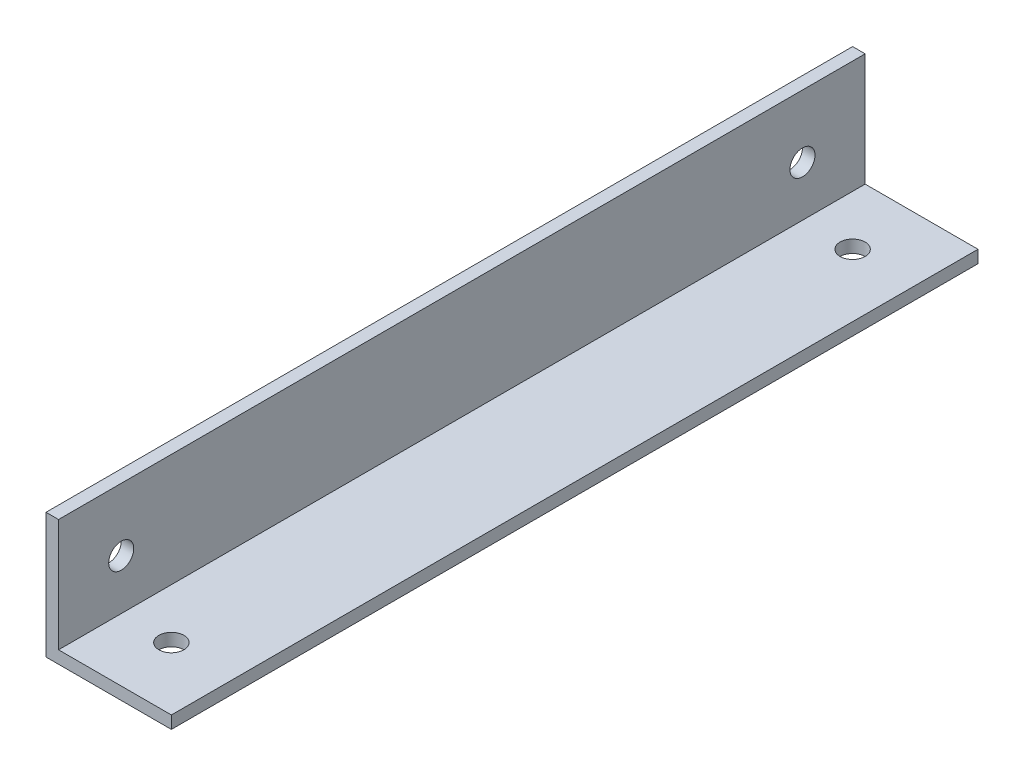
ISO-10303-21;
HEADER;
FILE_DESCRIPTION(('STEP AP214'),'2;1');
FILE_NAME('part.step','',(''),(''),'','','');
FILE_SCHEMA(('AUTOMOTIVE_DESIGN { 1 0 10303 214 1 1 1 1 }'));
ENDSEC;
DATA;
#1=APPLICATION_CONTEXT('core data for automotive mechanical design processes');
#2=APPLICATION_PROTOCOL_DEFINITION('international standard','automotive_design',2000,#1);
#3=PRODUCT_CONTEXT('',#1,'mechanical');
#4=PRODUCT('Part','Part','',(#3));
#5=PRODUCT_RELATED_PRODUCT_CATEGORY('part','',(#4));
#6=PRODUCT_DEFINITION_FORMATION('','',#4);
#7=PRODUCT_DEFINITION_CONTEXT('part definition',#1,'design');
#8=PRODUCT_DEFINITION('design','',#6,#7);
#9=PRODUCT_DEFINITION_SHAPE('','',#8);
#10=(LENGTH_UNIT() NAMED_UNIT(*) SI_UNIT(.MILLI.,.METRE.));
#11=(NAMED_UNIT(*) PLANE_ANGLE_UNIT() SI_UNIT($,.RADIAN.));
#12=(NAMED_UNIT(*) SI_UNIT($,.STERADIAN.) SOLID_ANGLE_UNIT());
#13=UNCERTAINTY_MEASURE_WITH_UNIT(LENGTH_MEASURE(1.E-05),#10,'distance_accuracy_value','');
#14=(GEOMETRIC_REPRESENTATION_CONTEXT(3) GLOBAL_UNCERTAINTY_ASSIGNED_CONTEXT((#13)) GLOBAL_UNIT_ASSIGNED_CONTEXT((#10,
#11,#12)) REPRESENTATION_CONTEXT('',''));
#15=CARTESIAN_POINT('',(0.,0.,0.));
#16=DIRECTION('',(0.,0.,1.));
#17=DIRECTION('',(1.,0.,0.));
#18=AXIS2_PLACEMENT_3D('',#15,#16,#17);
#19=CARTESIAN_POINT('',(-18.0730136814752,-1.56375661375662,96.5));
#20=DIRECTION('',(0.,-1.,0.));
#21=DIRECTION('',(1.,0.,0.));
#22=AXIS2_PLACEMENT_3D('',#19,#20,#21);
#23=PLANE('',#22);
#24=DIRECTION('',(-1.,0.,0.));
#25=VECTOR('',#24,1.);
#26=CARTESIAN_POINT('',(-18.0730136814752,-1.56375661375662,0.));
#27=LINE('',#26,#25);
#28=CARTESIAN_POINT('',(-18.0730136814752,-1.56375661375662,0.));
#29=VERTEX_POINT('',#28);
#30=CARTESIAN_POINT('',(-19.5730136814752,-1.56375661375661,0.));
#31=VERTEX_POINT('',#30);
#32=EDGE_CURVE('E117',#29,#31,#27,.T.);
#33=ORIENTED_EDGE('',*,*,#32,.T.);
#34=DIRECTION('',(0.,0.,-1.));
#35=VECTOR('',#34,1.);
#36=CARTESIAN_POINT('',(-19.5730136814752,-1.56375661375661,96.5));
#37=LINE('',#36,#35);
#38=CARTESIAN_POINT('',(-19.5730136814752,-1.56375661375661,96.5));
#39=VERTEX_POINT('',#38);
#40=EDGE_CURVE('E11',#39,#31,#37,.T.);
#41=ORIENTED_EDGE('',*,*,#40,.F.);
#42=DIRECTION('',(-1.,0.,0.));
#43=VECTOR('',#42,1.);
#44=CARTESIAN_POINT('',(-18.0730136814752,-1.56375661375662,96.5));
#45=LINE('',#44,#43);
#46=CARTESIAN_POINT('',(-18.0730136814752,-1.56375661375662,96.5));
#47=VERTEX_POINT('',#46);
#48=EDGE_CURVE('E128',#47,#39,#45,.T.);
#49=ORIENTED_EDGE('',*,*,#48,.F.);
#50=DIRECTION('',(0.,0.,-1.));
#51=VECTOR('',#50,1.);
#52=CARTESIAN_POINT('',(-18.0730136814752,-1.56375661375662,96.5));
#53=LINE('',#52,#51);
#54=EDGE_CURVE('E113',#47,#29,#53,.T.);
#55=ORIENTED_EDGE('',*,*,#54,.T.);
#56=EDGE_LOOP('',(#33,#41,#49,#55));
#57=FACE_BOUND('',#56,.T.);
#58=ADVANCED_FACE('F31',(#57),#23,.F.);
#59=CARTESIAN_POINT('',(-19.5730136814752,-1.56375661375661,96.5));
#60=DIRECTION('',(1.,0.,0.));
#61=DIRECTION('',(0.,1.,0.));
#62=AXIS2_PLACEMENT_3D('',#59,#60,#61);
#63=PLANE('',#62);
#64=CARTESIAN_POINT('',(-19.5730136814752,-9.06375661375662,7.5));
#65=DIRECTION('',(-1.,0.,0.));
#66=DIRECTION('',(0.,-1.,0.));
#67=AXIS2_PLACEMENT_3D('',#64,#65,#66);
#68=CIRCLE('',#67,1.5);
#69=CARTESIAN_POINT('',(-19.5730136814752,-10.5637566137566,7.5));
#70=VERTEX_POINT('',#69);
#71=EDGE_CURVE('E152',#70,#70,#68,.T.);
#72=ORIENTED_EDGE('',*,*,#71,.F.);
#73=EDGE_LOOP('',(#72));
#74=FACE_BOUND('',#73,.T.);
#75=CARTESIAN_POINT('',(-19.5730136814752,-9.06375661375662,89.));
#76=DIRECTION('',(-1.,0.,0.));
#77=DIRECTION('',(0.,-1.,0.));
#78=AXIS2_PLACEMENT_3D('',#75,#76,#77);
#79=CIRCLE('',#78,1.5);
#80=CARTESIAN_POINT('',(-19.5730136814752,-10.5637566137566,89.));
#81=VERTEX_POINT('',#80);
#82=EDGE_CURVE('E142',#81,#81,#79,.T.);
#83=ORIENTED_EDGE('',*,*,#82,.F.);
#84=EDGE_LOOP('',(#83));
#85=FACE_BOUND('',#84,.T.);
#86=DIRECTION('',(0.,-1.,0.));
#87=VECTOR('',#86,1.);
#88=CARTESIAN_POINT('',(-19.5730136814752,-1.56375661375661,0.));
#89=LINE('',#88,#87);
#90=CARTESIAN_POINT('',(-19.5730136814752,-16.5637566137566,0.));
#91=VERTEX_POINT('',#90);
#92=EDGE_CURVE('E120',#31,#91,#89,.T.);
#93=ORIENTED_EDGE('',*,*,#92,.T.);
#94=DIRECTION('',(0.,0.,-1.));
#95=VECTOR('',#94,1.);
#96=CARTESIAN_POINT('',(-19.5730136814752,-16.5637566137566,96.5));
#97=LINE('',#96,#95);
#98=CARTESIAN_POINT('',(-19.5730136814752,-16.5637566137566,96.5));
#99=VERTEX_POINT('',#98);
#100=EDGE_CURVE('E40',#99,#91,#97,.T.);
#101=ORIENTED_EDGE('',*,*,#100,.F.);
#102=DIRECTION('',(0.,-1.,0.));
#103=VECTOR('',#102,1.);
#104=CARTESIAN_POINT('',(-19.5730136814752,-1.56375661375661,96.5));
#105=LINE('',#104,#103);
#106=EDGE_CURVE('E86',#39,#99,#105,.T.);
#107=ORIENTED_EDGE('',*,*,#106,.F.);
#108=ORIENTED_EDGE('',*,*,#40,.T.);
#109=EDGE_LOOP('',(#93,#101,#107,#108));
#110=FACE_BOUND('',#109,.T.);
#111=ADVANCED_FACE('F160',(#74,#85,#110),#63,.F.);
#112=CARTESIAN_POINT('',(-19.5730136814752,-16.5637566137566,96.5));
#113=DIRECTION('',(0.,1.,0.));
#114=DIRECTION('',(0.,0.,1.));
#115=AXIS2_PLACEMENT_3D('',#112,#113,#114);
#116=PLANE('',#115);
#117=CARTESIAN_POINT('',(-12.0730136814752,-16.5637566137566,7.5));
#118=DIRECTION('',(0.,-1.,0.));
#119=DIRECTION('',(0.,0.,-1.));
#120=AXIS2_PLACEMENT_3D('',#117,#118,#119);
#121=CIRCLE('',#120,1.5);
#122=CARTESIAN_POINT('',(-12.0730136814752,-16.5637566137566,6.));
#123=VERTEX_POINT('',#122);
#124=EDGE_CURVE('E139',#123,#123,#121,.T.);
#125=ORIENTED_EDGE('',*,*,#124,.F.);
#126=EDGE_LOOP('',(#125));
#127=FACE_BOUND('',#126,.T.);
#128=CARTESIAN_POINT('',(-12.0730136814752,-16.5637566137566,89.));
#129=DIRECTION('',(0.,-1.,0.));
#130=DIRECTION('',(0.,0.,-1.));
#131=AXIS2_PLACEMENT_3D('',#128,#129,#130);
#132=CIRCLE('',#131,1.5);
#133=CARTESIAN_POINT('',(-12.0730136814752,-16.5637566137566,87.5));
#134=VERTEX_POINT('',#133);
#135=EDGE_CURVE('E136',#134,#134,#132,.T.);
#136=ORIENTED_EDGE('',*,*,#135,.F.);
#137=EDGE_LOOP('',(#136));
#138=FACE_BOUND('',#137,.T.);
#139=DIRECTION('',(1.,0.,0.));
#140=VECTOR('',#139,1.);
#141=CARTESIAN_POINT('',(-19.5730136814752,-16.5637566137566,0.));
#142=LINE('',#141,#140);
#143=CARTESIAN_POINT('',(-4.57301368147524,-16.5637566137566,0.));
#144=VERTEX_POINT('',#143);
#145=EDGE_CURVE('E123',#91,#144,#142,.T.);
#146=ORIENTED_EDGE('',*,*,#145,.T.);
#147=DIRECTION('',(0.,0.,-1.));
#148=VECTOR('',#147,1.);
#149=CARTESIAN_POINT('',(-4.57301368147524,-16.5637566137566,96.5));
#150=LINE('',#149,#148);
#151=CARTESIAN_POINT('',(-4.57301368147524,-16.5637566137566,96.5));
#152=VERTEX_POINT('',#151);
#153=EDGE_CURVE('E108',#152,#144,#150,.T.);
#154=ORIENTED_EDGE('',*,*,#153,.F.);
#155=DIRECTION('',(1.,0.,0.));
#156=VECTOR('',#155,1.);
#157=CARTESIAN_POINT('',(-19.5730136814752,-16.5637566137566,96.5));
#158=LINE('',#157,#156);
#159=EDGE_CURVE('E99',#99,#152,#158,.T.);
#160=ORIENTED_EDGE('',*,*,#159,.F.);
#161=ORIENTED_EDGE('',*,*,#100,.T.);
#162=EDGE_LOOP('',(#146,#154,#160,#161));
#163=FACE_BOUND('',#162,.T.);
#164=ADVANCED_FACE('F163',(#127,#138,#163),#116,.F.);
#165=CARTESIAN_POINT('',(-4.57301368147524,-16.5637566137566,96.5));
#166=DIRECTION('',(-1.,0.,0.));
#167=DIRECTION('',(0.,0.,1.));
#168=AXIS2_PLACEMENT_3D('',#165,#166,#167);
#169=PLANE('',#168);
#170=DIRECTION('',(0.,1.,0.));
#171=VECTOR('',#170,1.);
#172=CARTESIAN_POINT('',(-4.57301368147524,-16.5637566137566,0.));
#173=LINE('',#172,#171);
#174=CARTESIAN_POINT('',(-4.57301368147524,-15.0637566137566,0.));
#175=VERTEX_POINT('',#174);
#176=EDGE_CURVE('E107',#144,#175,#173,.T.);
#177=ORIENTED_EDGE('',*,*,#176,.T.);
#178=DIRECTION('',(0.,0.,-1.));
#179=VECTOR('',#178,1.);
#180=CARTESIAN_POINT('',(-4.57301368147524,-15.0637566137566,96.5));
#181=LINE('',#180,#179);
#182=CARTESIAN_POINT('',(-4.57301368147524,-15.0637566137566,96.5));
#183=VERTEX_POINT('',#182);
#184=EDGE_CURVE('E104',#183,#175,#181,.T.);
#185=ORIENTED_EDGE('',*,*,#184,.F.);
#186=DIRECTION('',(0.,1.,0.));
#187=VECTOR('',#186,1.);
#188=CARTESIAN_POINT('',(-4.57301368147524,-16.5637566137566,96.5));
#189=LINE('',#188,#187);
#190=EDGE_CURVE('E93',#152,#183,#189,.T.);
#191=ORIENTED_EDGE('',*,*,#190,.F.);
#192=ORIENTED_EDGE('',*,*,#153,.T.);
#193=EDGE_LOOP('',(#177,#185,#191,#192));
#194=FACE_BOUND('',#193,.T.);
#195=ADVANCED_FACE('F105',(#194),#169,.F.);
#196=CARTESIAN_POINT('',(-4.57301368147524,-15.0637566137566,96.5));
#197=DIRECTION('',(0.,-1.,0.));
#198=DIRECTION('',(1.,0.,0.));
#199=AXIS2_PLACEMENT_3D('',#196,#197,#198);
#200=PLANE('',#199);
#201=CARTESIAN_POINT('',(-12.0730136814752,-15.0637566137566,7.5));
#202=DIRECTION('',(0.,-1.,0.));
#203=DIRECTION('',(1.,0.,0.));
#204=AXIS2_PLACEMENT_3D('',#201,#202,#203);
#205=CIRCLE('',#204,1.5);
#206=CARTESIAN_POINT('',(-10.5730136814752,-15.0637566137566,7.5));
#207=VERTEX_POINT('',#206);
#208=EDGE_CURVE('E137',#207,#207,#205,.T.);
#209=ORIENTED_EDGE('',*,*,#208,.T.);
#210=EDGE_LOOP('',(#209));
#211=FACE_BOUND('',#210,.T.);
#212=CARTESIAN_POINT('',(-12.0730136814752,-15.0637566137566,89.));
#213=DIRECTION('',(0.,-1.,0.));
#214=DIRECTION('',(1.,0.,0.));
#215=AXIS2_PLACEMENT_3D('',#212,#213,#214);
#216=CIRCLE('',#215,1.5);
#217=CARTESIAN_POINT('',(-10.5730136814752,-15.0637566137566,89.));
#218=VERTEX_POINT('',#217);
#219=EDGE_CURVE('E121',#218,#218,#216,.T.);
#220=ORIENTED_EDGE('',*,*,#219,.T.);
#221=EDGE_LOOP('',(#220));
#222=FACE_BOUND('',#221,.T.);
#223=DIRECTION('',(-1.,0.,0.));
#224=VECTOR('',#223,1.);
#225=CARTESIAN_POINT('',(-4.57301368147524,-15.0637566137566,0.));
#226=LINE('',#225,#224);
#227=CARTESIAN_POINT('',(-18.0730136814752,-15.0637566137566,0.));
#228=VERTEX_POINT('',#227);
#229=EDGE_CURVE('E72',#175,#228,#226,.T.);
#230=ORIENTED_EDGE('',*,*,#229,.T.);
#231=DIRECTION('',(0.,0.,-1.));
#232=VECTOR('',#231,1.);
#233=CARTESIAN_POINT('',(-18.0730136814752,-15.0637566137566,96.5));
#234=LINE('',#233,#232);
#235=CARTESIAN_POINT('',(-18.0730136814752,-15.0637566137566,96.5));
#236=VERTEX_POINT('',#235);
#237=EDGE_CURVE('E109',#236,#228,#234,.T.);
#238=ORIENTED_EDGE('',*,*,#237,.F.);
#239=DIRECTION('',(-1.,0.,0.));
#240=VECTOR('',#239,1.);
#241=CARTESIAN_POINT('',(-4.57301368147524,-15.0637566137566,96.5));
#242=LINE('',#241,#240);
#243=EDGE_CURVE('E97',#183,#236,#242,.T.);
#244=ORIENTED_EDGE('',*,*,#243,.F.);
#245=ORIENTED_EDGE('',*,*,#184,.T.);
#246=EDGE_LOOP('',(#230,#238,#244,#245));
#247=FACE_BOUND('',#246,.T.);
#248=ADVANCED_FACE('F111',(#211,#222,#247),#200,.F.);
#249=CARTESIAN_POINT('',(-18.0730136814752,-15.0637566137566,96.5));
#250=DIRECTION('',(-1.,0.,0.));
#251=DIRECTION('',(0.,0.,1.));
#252=AXIS2_PLACEMENT_3D('',#249,#250,#251);
#253=PLANE('',#252);
#254=CARTESIAN_POINT('',(-18.0730136814752,-9.06375661375662,7.5));
#255=DIRECTION('',(-1.,0.,0.));
#256=DIRECTION('',(0.,0.,1.));
#257=AXIS2_PLACEMENT_3D('',#254,#255,#256);
#258=CIRCLE('',#257,1.5);
#259=CARTESIAN_POINT('',(-18.0730136814752,-9.06375661375662,9.));
#260=VERTEX_POINT('',#259);
#261=EDGE_CURVE('E34',#260,#260,#258,.T.);
#262=ORIENTED_EDGE('',*,*,#261,.T.);
#263=EDGE_LOOP('',(#262));
#264=FACE_BOUND('',#263,.T.);
#265=CARTESIAN_POINT('',(-18.0730136814752,-9.06375661375662,89.));
#266=DIRECTION('',(-1.,0.,0.));
#267=DIRECTION('',(0.,0.,1.));
#268=AXIS2_PLACEMENT_3D('',#265,#266,#267);
#269=CIRCLE('',#268,1.5);
#270=CARTESIAN_POINT('',(-18.0730136814752,-9.06375661375662,90.5));
#271=VERTEX_POINT('',#270);
#272=EDGE_CURVE('E140',#271,#271,#269,.T.);
#273=ORIENTED_EDGE('',*,*,#272,.T.);
#274=EDGE_LOOP('',(#273));
#275=FACE_BOUND('',#274,.T.);
#276=DIRECTION('',(0.,1.,0.));
#277=VECTOR('',#276,1.);
#278=CARTESIAN_POINT('',(-18.0730136814752,-15.0637566137566,0.));
#279=LINE('',#278,#277);
#280=EDGE_CURVE('E78',#228,#29,#279,.T.);
#281=ORIENTED_EDGE('',*,*,#280,.T.);
#282=ORIENTED_EDGE('',*,*,#54,.F.);
#283=DIRECTION('',(0.,1.,0.));
#284=VECTOR('',#283,1.);
#285=CARTESIAN_POINT('',(-18.0730136814752,-15.0637566137566,96.5));
#286=LINE('',#285,#284);
#287=EDGE_CURVE('E49',#236,#47,#286,.T.);
#288=ORIENTED_EDGE('',*,*,#287,.F.);
#289=ORIENTED_EDGE('',*,*,#237,.T.);
#290=EDGE_LOOP('',(#281,#282,#288,#289));
#291=FACE_BOUND('',#290,.T.);
#292=ADVANCED_FACE('F168',(#264,#275,#291),#253,.F.);
#293=CARTESIAN_POINT('',(-19.5730136814752,-1.56375661375661,96.5));
#294=DIRECTION('',(0.,0.,1.));
#295=DIRECTION('',(1.,0.,0.));
#296=AXIS2_PLACEMENT_3D('',#293,#294,#295);
#297=PLANE('',#296);
#298=ORIENTED_EDGE('',*,*,#48,.T.);
#299=ORIENTED_EDGE('',*,*,#106,.T.);
#300=ORIENTED_EDGE('',*,*,#159,.T.);
#301=ORIENTED_EDGE('',*,*,#190,.T.);
#302=ORIENTED_EDGE('',*,*,#243,.T.);
#303=ORIENTED_EDGE('',*,*,#287,.T.);
#304=EDGE_LOOP('',(#298,#299,#300,#301,#302,#303));
#305=FACE_BOUND('',#304,.T.);
#306=ADVANCED_FACE('F95',(#305),#297,.T.);
#307=CARTESIAN_POINT('',(-19.5730136814752,-1.56375661375661,0.));
#308=DIRECTION('',(0.,0.,1.));
#309=DIRECTION('',(1.,0.,0.));
#310=AXIS2_PLACEMENT_3D('',#307,#308,#309);
#311=PLANE('',#310);
#312=ORIENTED_EDGE('',*,*,#32,.F.);
#313=ORIENTED_EDGE('',*,*,#280,.F.);
#314=ORIENTED_EDGE('',*,*,#229,.F.);
#315=ORIENTED_EDGE('',*,*,#176,.F.);
#316=ORIENTED_EDGE('',*,*,#145,.F.);
#317=ORIENTED_EDGE('',*,*,#92,.F.);
#318=EDGE_LOOP('',(#312,#313,#314,#315,#316,#317));
#319=FACE_BOUND('',#318,.T.);
#320=ADVANCED_FACE('F166',(#319),#311,.F.);
#321=CARTESIAN_POINT('',(-12.0730136814752,81.4362433862434,89.));
#322=DIRECTION('',(0.,-1.,0.));
#323=DIRECTION('',(0.,0.,-1.));
#324=AXIS2_PLACEMENT_3D('',#321,#322,#323);
#325=CYLINDRICAL_SURFACE('',#324,1.5);
#326=ORIENTED_EDGE('',*,*,#135,.T.);
#327=EDGE_LOOP('',(#326));
#328=FACE_BOUND('',#327,.T.);
#329=ORIENTED_EDGE('',*,*,#219,.F.);
#330=EDGE_LOOP('',(#329));
#331=FACE_BOUND('',#330,.T.);
#332=ADVANCED_FACE('F212',(#328,#331),#325,.F.);
#333=CARTESIAN_POINT('',(-12.0730136814752,81.4362433862434,7.5));
#334=DIRECTION('',(0.,-1.,0.));
#335=DIRECTION('',(0.,0.,-1.));
#336=AXIS2_PLACEMENT_3D('',#333,#334,#335);
#337=CYLINDRICAL_SURFACE('',#336,1.5);
#338=ORIENTED_EDGE('',*,*,#124,.T.);
#339=EDGE_LOOP('',(#338));
#340=FACE_BOUND('',#339,.T.);
#341=ORIENTED_EDGE('',*,*,#208,.F.);
#342=EDGE_LOOP('',(#341));
#343=FACE_BOUND('',#342,.T.);
#344=ADVANCED_FACE('F217',(#340,#343),#337,.F.);
#345=CARTESIAN_POINT('',(78.4269863185248,-9.06375661375657,89.));
#346=DIRECTION('',(-1.,0.,0.));
#347=DIRECTION('',(0.,-1.,0.));
#348=AXIS2_PLACEMENT_3D('',#345,#346,#347);
#349=CYLINDRICAL_SURFACE('',#348,1.5);
#350=ORIENTED_EDGE('',*,*,#82,.T.);
#351=EDGE_LOOP('',(#350));
#352=FACE_BOUND('',#351,.T.);
#353=ORIENTED_EDGE('',*,*,#272,.F.);
#354=EDGE_LOOP('',(#353));
#355=FACE_BOUND('',#354,.T.);
#356=ADVANCED_FACE('F228',(#352,#355),#349,.F.);
#357=CARTESIAN_POINT('',(78.4269863185248,-9.06375661375658,7.5));
#358=DIRECTION('',(-1.,0.,0.));
#359=DIRECTION('',(0.,-1.,0.));
#360=AXIS2_PLACEMENT_3D('',#357,#358,#359);
#361=CYLINDRICAL_SURFACE('',#360,1.5);
#362=ORIENTED_EDGE('',*,*,#71,.T.);
#363=EDGE_LOOP('',(#362));
#364=FACE_BOUND('',#363,.T.);
#365=ORIENTED_EDGE('',*,*,#261,.F.);
#366=EDGE_LOOP('',(#365));
#367=FACE_BOUND('',#366,.T.);
#368=ADVANCED_FACE('F248',(#364,#367),#361,.F.);
#369=CLOSED_SHELL('',(#58,#111,#164,#195,#248,#292,#306,#320,#332,#344,#356,#368));
#370=MANIFOLD_SOLID_BREP('B2',#369);
#371=ADVANCED_BREP_SHAPE_REPRESENTATION('',(#18,#370),#14);
#372=SHAPE_DEFINITION_REPRESENTATION(#9,#371);
ENDSEC;
END-ISO-10303-21;
